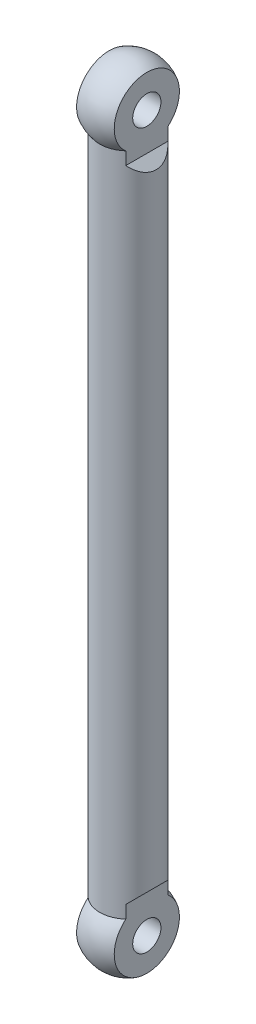
ISO-10303-21;
HEADER;
FILE_DESCRIPTION(('STEP AP214'),'2;1');
FILE_NAME('part.step','',(''),(''),'','','');
FILE_SCHEMA(('AUTOMOTIVE_DESIGN { 1 0 10303 214 1 1 1 1 }'));
ENDSEC;
DATA;
#1=APPLICATION_CONTEXT('core data for automotive mechanical design processes');
#2=APPLICATION_PROTOCOL_DEFINITION('international standard','automotive_design',2000,#1);
#3=PRODUCT_CONTEXT('',#1,'mechanical');
#4=PRODUCT('Part','Part','',(#3));
#5=PRODUCT_RELATED_PRODUCT_CATEGORY('part','',(#4));
#6=PRODUCT_DEFINITION_FORMATION('','',#4);
#7=PRODUCT_DEFINITION_CONTEXT('part definition',#1,'design');
#8=PRODUCT_DEFINITION('design','',#6,#7);
#9=PRODUCT_DEFINITION_SHAPE('','',#8);
#10=(LENGTH_UNIT() NAMED_UNIT(*) SI_UNIT(.MILLI.,.METRE.));
#11=(NAMED_UNIT(*) PLANE_ANGLE_UNIT() SI_UNIT($,.RADIAN.));
#12=(NAMED_UNIT(*) SI_UNIT($,.STERADIAN.) SOLID_ANGLE_UNIT());
#13=UNCERTAINTY_MEASURE_WITH_UNIT(LENGTH_MEASURE(1.E-05),#10,'distance_accuracy_value','');
#14=(GEOMETRIC_REPRESENTATION_CONTEXT(3) GLOBAL_UNCERTAINTY_ASSIGNED_CONTEXT((#13)) GLOBAL_UNIT_ASSIGNED_CONTEXT((#10,
#11,#12)) REPRESENTATION_CONTEXT('',''));
#15=CARTESIAN_POINT('',(0.,0.,0.));
#16=DIRECTION('',(0.,0.,1.));
#17=DIRECTION('',(1.,0.,0.));
#18=AXIS2_PLACEMENT_3D('',#15,#16,#17);
#19=CARTESIAN_POINT('',(0.,0.,0.));
#20=DIRECTION('',(0.,-1.,0.));
#21=DIRECTION('',(0.,0.,1.));
#22=AXIS2_PLACEMENT_3D('',#19,#20,#21);
#23=SPHERICAL_SURFACE('',#22,4.);
#24=CARTESIAN_POINT('',(0.,2.64575131106459,0.));
#25=DIRECTION('',(0.,-1.,0.));
#26=DIRECTION('',(0.,0.,-1.));
#27=AXIS2_PLACEMENT_3D('',#24,#25,#26);
#28=CIRCLE('',#27,3.);
#29=CARTESIAN_POINT('',(2.,2.64575131106459,2.23606797749979));
#30=VERTEX_POINT('',#29);
#31=CARTESIAN_POINT('',(-2.,2.64575131106459,2.23606797749979));
#32=VERTEX_POINT('',#31);
#33=EDGE_CURVE('E139',#30,#32,#28,.T.);
#34=ORIENTED_EDGE('',*,*,#33,.T.);
#35=CARTESIAN_POINT('',(-2.,0.,0.));
#36=DIRECTION('',(-1.,0.,0.));
#37=DIRECTION('',(0.,-1.,0.));
#38=AXIS2_PLACEMENT_3D('',#35,#36,#37);
#39=CIRCLE('',#38,3.46410161513776);
#40=CARTESIAN_POINT('',(-2.,2.64575131106459,-2.23606797749979));
#41=VERTEX_POINT('',#40);
#42=EDGE_CURVE('E50',#32,#41,#39,.F.);
#43=ORIENTED_EDGE('',*,*,#42,.T.);
#44=CARTESIAN_POINT('',(2.,2.64575131106459,-2.23606797749979));
#45=VERTEX_POINT('',#44);
#46=EDGE_CURVE('E138',#41,#45,#28,.T.);
#47=ORIENTED_EDGE('',*,*,#46,.T.);
#48=CARTESIAN_POINT('',(2.,0.,0.));
#49=DIRECTION('',(-1.,0.,0.));
#50=DIRECTION('',(0.,-1.,0.));
#51=AXIS2_PLACEMENT_3D('',#48,#49,#50);
#52=CIRCLE('',#51,3.46410161513776);
#53=EDGE_CURVE('E132',#30,#45,#52,.F.);
#54=ORIENTED_EDGE('',*,*,#53,.F.);
#55=EDGE_LOOP('',(#34,#43,#47,#54));
#56=FACE_BOUND('',#55,.T.);
#57=ADVANCED_FACE('F34',(#56),#23,.T.);
#58=CARTESIAN_POINT('',(0.,-4.,0.));
#59=DIRECTION('',(0.,-1.,0.));
#60=DIRECTION('',(0.,0.,-1.));
#61=AXIS2_PLACEMENT_3D('',#58,#59,#60);
#62=CYLINDRICAL_SURFACE('',#61,3.);
#63=ORIENTED_EDGE('',*,*,#46,.F.);
#64=DIRECTION('',(0.,-1.,0.));
#65=VECTOR('',#64,1.);
#66=CARTESIAN_POINT('',(-2.,-4.,-2.23606797749979));
#67=LINE('',#66,#65);
#68=CARTESIAN_POINT('',(-2.,3.99999999999999,-2.23606797749979));
#69=VERTEX_POINT('',#68);
#70=EDGE_CURVE('E42',#41,#69,#67,.F.);
#71=ORIENTED_EDGE('',*,*,#70,.T.);
#72=CARTESIAN_POINT('',(0.,1.99999999999999,0.));
#73=DIRECTION('',(-0.707106781186548,-0.707106781186547,0.));
#74=DIRECTION('',(0.707106781186547,-0.707106781186548,0.));
#75=AXIS2_PLACEMENT_3D('',#72,#73,#74);
#76=ELLIPSE('',#75,4.24264068711929,3.);
#77=CARTESIAN_POINT('',(-2.,3.99999999999999,2.23606797749979));
#78=VERTEX_POINT('',#77);
#79=EDGE_CURVE('E156',#69,#78,#76,.F.);
#80=ORIENTED_EDGE('',*,*,#79,.T.);
#81=DIRECTION('',(0.,-1.,0.));
#82=VECTOR('',#81,1.);
#83=CARTESIAN_POINT('',(-2.,-4.,2.23606797749979));
#84=LINE('',#83,#82);
#85=EDGE_CURVE('E154',#78,#32,#84,.T.);
#86=ORIENTED_EDGE('',*,*,#85,.T.);
#87=ORIENTED_EDGE('',*,*,#33,.F.);
#88=DIRECTION('',(0.,-1.,0.));
#89=VECTOR('',#88,1.);
#90=CARTESIAN_POINT('',(2.,-4.,2.23606797749979));
#91=LINE('',#90,#89);
#92=CARTESIAN_POINT('',(2.,3.99999999999999,2.23606797749979));
#93=VERTEX_POINT('',#92);
#94=EDGE_CURVE('E146',#93,#30,#91,.T.);
#95=ORIENTED_EDGE('',*,*,#94,.F.);
#96=CARTESIAN_POINT('',(0.,1.99999999999999,0.));
#97=DIRECTION('',(-0.707106781186548,0.707106781186547,0.));
#98=DIRECTION('',(-0.707106781186547,-0.707106781186548,0.));
#99=AXIS2_PLACEMENT_3D('',#96,#97,#98);
#100=ELLIPSE('',#99,4.24264068711929,3.);
#101=CARTESIAN_POINT('',(2.,3.99999999999999,-2.23606797749979));
#102=VERTEX_POINT('',#101);
#103=EDGE_CURVE('E144',#102,#93,#100,.F.);
#104=ORIENTED_EDGE('',*,*,#103,.F.);
#105=DIRECTION('',(0.,-1.,0.));
#106=VECTOR('',#105,1.);
#107=CARTESIAN_POINT('',(2.,-4.,-2.23606797749979));
#108=LINE('',#107,#106);
#109=EDGE_CURVE('E148',#45,#102,#108,.F.);
#110=ORIENTED_EDGE('',*,*,#109,.F.);
#111=EDGE_LOOP('',(#63,#71,#80,#86,#87,#95,#104,#110));
#112=FACE_BOUND('',#111,.T.);
#113=CARTESIAN_POINT('',(0.,74.,0.));
#114=DIRECTION('',(-0.707106781186548,0.707106781186547,0.));
#115=DIRECTION('',(-0.707106781186547,-0.707106781186548,0.));
#116=AXIS2_PLACEMENT_3D('',#113,#114,#115);
#117=ELLIPSE('',#116,4.24264068711929,3.);
#118=CARTESIAN_POINT('',(-2.,72.,2.23606797749979));
#119=VERTEX_POINT('',#118);
#120=CARTESIAN_POINT('',(-2.,72.,-2.23606797749979));
#121=VERTEX_POINT('',#120);
#122=EDGE_CURVE('E11',#119,#121,#117,.F.);
#123=ORIENTED_EDGE('',*,*,#122,.T.);
#124=DIRECTION('',(0.,-1.,0.));
#125=VECTOR('',#124,1.);
#126=CARTESIAN_POINT('',(-2.00000000000001,-4.,-2.23606797749978));
#127=LINE('',#126,#125);
#128=CARTESIAN_POINT('',(-2.,73.3542486889354,-2.23606797749979));
#129=VERTEX_POINT('',#128);
#130=EDGE_CURVE('E101',#121,#129,#127,.F.);
#131=ORIENTED_EDGE('',*,*,#130,.T.);
#132=CARTESIAN_POINT('',(0.,73.3542486889354,0.));
#133=DIRECTION('',(0.,-1.,0.));
#134=DIRECTION('',(0.,0.,-1.));
#135=AXIS2_PLACEMENT_3D('',#132,#133,#134);
#136=CIRCLE('',#135,3.);
#137=CARTESIAN_POINT('',(2.,73.3542486889354,-2.23606797749979));
#138=VERTEX_POINT('',#137);
#139=EDGE_CURVE('E135',#129,#138,#136,.T.);
#140=ORIENTED_EDGE('',*,*,#139,.T.);
#141=DIRECTION('',(0.,-1.,0.));
#142=VECTOR('',#141,1.);
#143=CARTESIAN_POINT('',(2.00000000000001,-4.,-2.23606797749978));
#144=LINE('',#143,#142);
#145=CARTESIAN_POINT('',(2.,72.,-2.23606797749978));
#146=VERTEX_POINT('',#145);
#147=EDGE_CURVE('E129',#146,#138,#144,.F.);
#148=ORIENTED_EDGE('',*,*,#147,.F.);
#149=CARTESIAN_POINT('',(0.,74.,0.));
#150=DIRECTION('',(-0.707106781186548,-0.707106781186547,0.));
#151=DIRECTION('',(0.707106781186547,-0.707106781186548,0.));
#152=AXIS2_PLACEMENT_3D('',#149,#150,#151);
#153=ELLIPSE('',#152,4.24264068711929,3.);
#154=CARTESIAN_POINT('',(2.,72.,2.23606797749978));
#155=VERTEX_POINT('',#154);
#156=EDGE_CURVE('E151',#155,#146,#153,.F.);
#157=ORIENTED_EDGE('',*,*,#156,.F.);
#158=DIRECTION('',(0.,-1.,0.));
#159=VECTOR('',#158,1.);
#160=CARTESIAN_POINT('',(2.00000000000001,-4.,2.23606797749978));
#161=LINE('',#160,#159);
#162=CARTESIAN_POINT('',(2.,73.3542486889354,2.23606797749979));
#163=VERTEX_POINT('',#162);
#164=EDGE_CURVE('E125',#163,#155,#161,.T.);
#165=ORIENTED_EDGE('',*,*,#164,.F.);
#166=CARTESIAN_POINT('',(-2.,73.3542486889354,2.23606797749979));
#167=VERTEX_POINT('',#166);
#168=EDGE_CURVE('E136',#163,#167,#136,.T.);
#169=ORIENTED_EDGE('',*,*,#168,.T.);
#170=DIRECTION('',(0.,-1.,0.));
#171=VECTOR('',#170,1.);
#172=CARTESIAN_POINT('',(-2.00000000000001,-4.,2.23606797749978));
#173=LINE('',#172,#171);
#174=EDGE_CURVE('E58',#167,#119,#173,.T.);
#175=ORIENTED_EDGE('',*,*,#174,.T.);
#176=EDGE_LOOP('',(#123,#131,#140,#148,#157,#165,#169,#175));
#177=FACE_BOUND('',#176,.T.);
#178=ADVANCED_FACE('F100',(#112,#177),#62,.T.);
#179=CARTESIAN_POINT('',(0.,76.,0.));
#180=DIRECTION('',(0.,-1.,0.));
#181=DIRECTION('',(0.,0.,-1.));
#182=AXIS2_PLACEMENT_3D('',#179,#180,#181);
#183=SPHERICAL_SURFACE('',#182,4.);
#184=ORIENTED_EDGE('',*,*,#139,.F.);
#185=CARTESIAN_POINT('',(-2.,76.,0.));
#186=DIRECTION('',(-1.,0.,0.));
#187=DIRECTION('',(0.,-1.,0.));
#188=AXIS2_PLACEMENT_3D('',#185,#186,#187);
#189=CIRCLE('',#188,3.46410161513776);
#190=EDGE_CURVE('E108',#129,#167,#189,.F.);
#191=ORIENTED_EDGE('',*,*,#190,.T.);
#192=ORIENTED_EDGE('',*,*,#168,.F.);
#193=CARTESIAN_POINT('',(2.,76.,0.));
#194=DIRECTION('',(-1.,0.,0.));
#195=DIRECTION('',(0.,-1.,0.));
#196=AXIS2_PLACEMENT_3D('',#193,#194,#195);
#197=CIRCLE('',#196,3.46410161513776);
#198=EDGE_CURVE('E142',#138,#163,#197,.F.);
#199=ORIENTED_EDGE('',*,*,#198,.F.);
#200=EDGE_LOOP('',(#184,#191,#192,#199));
#201=FACE_BOUND('',#200,.T.);
#202=ADVANCED_FACE('F206',(#201),#183,.T.);
#203=CARTESIAN_POINT('',(2.,72.,-4.));
#204=DIRECTION('',(-0.707106781186548,-0.707106781186547,0.));
#205=DIRECTION('',(0.707106781186547,-0.707106781186548,0.));
#206=AXIS2_PLACEMENT_3D('',#203,#204,#205);
#207=PLANE('',#206);
#208=ORIENTED_EDGE('',*,*,#156,.T.);
#209=DIRECTION('',(0.,0.,1.));
#210=VECTOR('',#209,1.);
#211=CARTESIAN_POINT('',(2.,72.,-4.));
#212=LINE('',#211,#210);
#213=EDGE_CURVE('E122',#146,#155,#212,.T.);
#214=ORIENTED_EDGE('',*,*,#213,.T.);
#215=EDGE_LOOP('',(#208,#214));
#216=FACE_BOUND('',#215,.T.);
#217=ADVANCED_FACE('F210',(#216),#207,.F.);
#218=CARTESIAN_POINT('',(2.,81.,-4.));
#219=DIRECTION('',(-1.,0.,0.));
#220=DIRECTION('',(0.,-1.,0.));
#221=AXIS2_PLACEMENT_3D('',#218,#219,#220);
#222=PLANE('',#221);
#223=CARTESIAN_POINT('',(2.,76.,0.));
#224=DIRECTION('',(1.,0.,0.));
#225=DIRECTION('',(0.,1.,0.));
#226=AXIS2_PLACEMENT_3D('',#223,#224,#225);
#227=CIRCLE('',#226,1.5);
#228=CARTESIAN_POINT('',(2.,77.5,0.));
#229=VERTEX_POINT('',#228);
#230=EDGE_CURVE('E162',#229,#229,#227,.T.);
#231=ORIENTED_EDGE('',*,*,#230,.F.);
#232=EDGE_LOOP('',(#231));
#233=FACE_BOUND('',#232,.T.);
#234=ORIENTED_EDGE('',*,*,#147,.T.);
#235=ORIENTED_EDGE('',*,*,#198,.T.);
#236=ORIENTED_EDGE('',*,*,#164,.T.);
#237=ORIENTED_EDGE('',*,*,#213,.F.);
#238=EDGE_LOOP('',(#234,#235,#236,#237));
#239=FACE_BOUND('',#238,.T.);
#240=ADVANCED_FACE('F178',(#233,#239),#222,.F.);
#241=CARTESIAN_POINT('',(2.,-5.00000000000002,-4.));
#242=DIRECTION('',(-1.,0.,0.));
#243=DIRECTION('',(0.,-1.,0.));
#244=AXIS2_PLACEMENT_3D('',#241,#242,#243);
#245=PLANE('',#244);
#246=CARTESIAN_POINT('',(2.00000000000001,0.,0.));
#247=DIRECTION('',(1.,0.,0.));
#248=DIRECTION('',(0.,1.,0.));
#249=AXIS2_PLACEMENT_3D('',#246,#247,#248);
#250=CIRCLE('',#249,1.5);
#251=CARTESIAN_POINT('',(2.00000000000001,1.5,0.));
#252=VERTEX_POINT('',#251);
#253=EDGE_CURVE('E117',#252,#252,#250,.T.);
#254=ORIENTED_EDGE('',*,*,#253,.F.);
#255=EDGE_LOOP('',(#254));
#256=FACE_BOUND('',#255,.T.);
#257=ORIENTED_EDGE('',*,*,#109,.T.);
#258=DIRECTION('',(0.,0.,1.));
#259=VECTOR('',#258,1.);
#260=CARTESIAN_POINT('',(2.,3.99999999999999,-4.));
#261=LINE('',#260,#259);
#262=EDGE_CURVE('E121',#102,#93,#261,.T.);
#263=ORIENTED_EDGE('',*,*,#262,.T.);
#264=ORIENTED_EDGE('',*,*,#94,.T.);
#265=ORIENTED_EDGE('',*,*,#53,.T.);
#266=EDGE_LOOP('',(#257,#263,#264,#265));
#267=FACE_BOUND('',#266,.T.);
#268=ADVANCED_FACE('F174',(#256,#267),#245,.F.);
#269=CARTESIAN_POINT('',(2.,3.99999999999999,-4.));
#270=DIRECTION('',(-0.707106781186548,0.707106781186547,0.));
#271=DIRECTION('',(-0.707106781186547,-0.707106781186548,0.));
#272=AXIS2_PLACEMENT_3D('',#269,#270,#271);
#273=PLANE('',#272);
#274=ORIENTED_EDGE('',*,*,#262,.F.);
#275=ORIENTED_EDGE('',*,*,#103,.T.);
#276=EDGE_LOOP('',(#274,#275));
#277=FACE_BOUND('',#276,.T.);
#278=ADVANCED_FACE('F177',(#277),#273,.F.);
#279=CARTESIAN_POINT('',(-2.,81.,-4.));
#280=DIRECTION('',(-1.,0.,0.));
#281=DIRECTION('',(0.,-1.,0.));
#282=AXIS2_PLACEMENT_3D('',#279,#280,#281);
#283=PLANE('',#282);
#284=CARTESIAN_POINT('',(-2.,76.,0.));
#285=DIRECTION('',(-1.,0.,0.));
#286=DIRECTION('',(0.,-1.,0.));
#287=AXIS2_PLACEMENT_3D('',#284,#285,#286);
#288=CIRCLE('',#287,1.5);
#289=CARTESIAN_POINT('',(-2.,74.5,0.));
#290=VERTEX_POINT('',#289);
#291=EDGE_CURVE('E37',#290,#290,#288,.T.);
#292=ORIENTED_EDGE('',*,*,#291,.F.);
#293=EDGE_LOOP('',(#292));
#294=FACE_BOUND('',#293,.T.);
#295=DIRECTION('',(0.,0.,1.));
#296=VECTOR('',#295,1.);
#297=CARTESIAN_POINT('',(-2.,72.,-4.));
#298=LINE('',#297,#296);
#299=EDGE_CURVE('E107',#121,#119,#298,.T.);
#300=ORIENTED_EDGE('',*,*,#299,.T.);
#301=ORIENTED_EDGE('',*,*,#174,.F.);
#302=ORIENTED_EDGE('',*,*,#190,.F.);
#303=ORIENTED_EDGE('',*,*,#130,.F.);
#304=EDGE_LOOP('',(#300,#301,#302,#303));
#305=FACE_BOUND('',#304,.T.);
#306=ADVANCED_FACE('F106',(#294,#305),#283,.T.);
#307=CARTESIAN_POINT('',(-2.,72.,-4.));
#308=DIRECTION('',(-0.707106781186548,0.707106781186547,0.));
#309=DIRECTION('',(-0.707106781186547,-0.707106781186548,0.));
#310=AXIS2_PLACEMENT_3D('',#307,#308,#309);
#311=PLANE('',#310);
#312=ORIENTED_EDGE('',*,*,#122,.F.);
#313=ORIENTED_EDGE('',*,*,#299,.F.);
#314=EDGE_LOOP('',(#312,#313));
#315=FACE_BOUND('',#314,.T.);
#316=ADVANCED_FACE('F110',(#315),#311,.T.);
#317=CARTESIAN_POINT('',(-2.,3.99999999999999,-4.));
#318=DIRECTION('',(-0.707106781186548,-0.707106781186547,0.));
#319=DIRECTION('',(0.707106781186547,-0.707106781186548,0.));
#320=AXIS2_PLACEMENT_3D('',#317,#318,#319);
#321=PLANE('',#320);
#322=DIRECTION('',(0.,0.,1.));
#323=VECTOR('',#322,1.);
#324=CARTESIAN_POINT('',(-2.,3.99999999999999,-4.));
#325=LINE('',#324,#323);
#326=EDGE_CURVE('E111',#69,#78,#325,.T.);
#327=ORIENTED_EDGE('',*,*,#326,.T.);
#328=ORIENTED_EDGE('',*,*,#79,.F.);
#329=EDGE_LOOP('',(#327,#328));
#330=FACE_BOUND('',#329,.T.);
#331=ADVANCED_FACE('F192',(#330),#321,.T.);
#332=CARTESIAN_POINT('',(-2.,-5.00000000000002,-4.));
#333=DIRECTION('',(-1.,0.,0.));
#334=DIRECTION('',(0.,-1.,0.));
#335=AXIS2_PLACEMENT_3D('',#332,#333,#334);
#336=PLANE('',#335);
#337=CARTESIAN_POINT('',(-2.,0.,0.));
#338=DIRECTION('',(-1.,0.,0.));
#339=DIRECTION('',(0.,-1.,0.));
#340=AXIS2_PLACEMENT_3D('',#337,#338,#339);
#341=CIRCLE('',#340,1.5);
#342=CARTESIAN_POINT('',(-2.,-1.5,0.));
#343=VERTEX_POINT('',#342);
#344=EDGE_CURVE('E160',#343,#343,#341,.T.);
#345=ORIENTED_EDGE('',*,*,#344,.F.);
#346=EDGE_LOOP('',(#345));
#347=FACE_BOUND('',#346,.T.);
#348=ORIENTED_EDGE('',*,*,#42,.F.);
#349=ORIENTED_EDGE('',*,*,#85,.F.);
#350=ORIENTED_EDGE('',*,*,#326,.F.);
#351=ORIENTED_EDGE('',*,*,#70,.F.);
#352=EDGE_LOOP('',(#348,#349,#350,#351));
#353=FACE_BOUND('',#352,.T.);
#354=ADVANCED_FACE('F190',(#347,#353),#336,.T.);
#355=CARTESIAN_POINT('',(-3.,0.,0.));
#356=DIRECTION('',(1.,0.,0.));
#357=DIRECTION('',(0.,1.,0.));
#358=AXIS2_PLACEMENT_3D('',#355,#356,#357);
#359=CYLINDRICAL_SURFACE('',#358,1.5);
#360=ORIENTED_EDGE('',*,*,#344,.T.);
#361=EDGE_LOOP('',(#360));
#362=FACE_BOUND('',#361,.T.);
#363=ORIENTED_EDGE('',*,*,#253,.T.);
#364=EDGE_LOOP('',(#363));
#365=FACE_BOUND('',#364,.T.);
#366=ADVANCED_FACE('F172',(#362,#365),#359,.F.);
#367=CARTESIAN_POINT('',(-3.00000000000001,76.,0.));
#368=DIRECTION('',(1.,0.,0.));
#369=DIRECTION('',(0.,1.,0.));
#370=AXIS2_PLACEMENT_3D('',#367,#368,#369);
#371=CYLINDRICAL_SURFACE('',#370,1.5);
#372=ORIENTED_EDGE('',*,*,#291,.T.);
#373=EDGE_LOOP('',(#372));
#374=FACE_BOUND('',#373,.T.);
#375=ORIENTED_EDGE('',*,*,#230,.T.);
#376=EDGE_LOOP('',(#375));
#377=FACE_BOUND('',#376,.T.);
#378=ADVANCED_FACE('F276',(#374,#377),#371,.F.);
#379=CLOSED_SHELL('',(#57,#178,#202,#217,#240,#268,#278,#306,#316,#331,#354,#366,#378));
#380=MANIFOLD_SOLID_BREP('B2',#379);
#381=ADVANCED_BREP_SHAPE_REPRESENTATION('',(#18,#380),#14);
#382=SHAPE_DEFINITION_REPRESENTATION(#9,#381);
ENDSEC;
END-ISO-10303-21;
